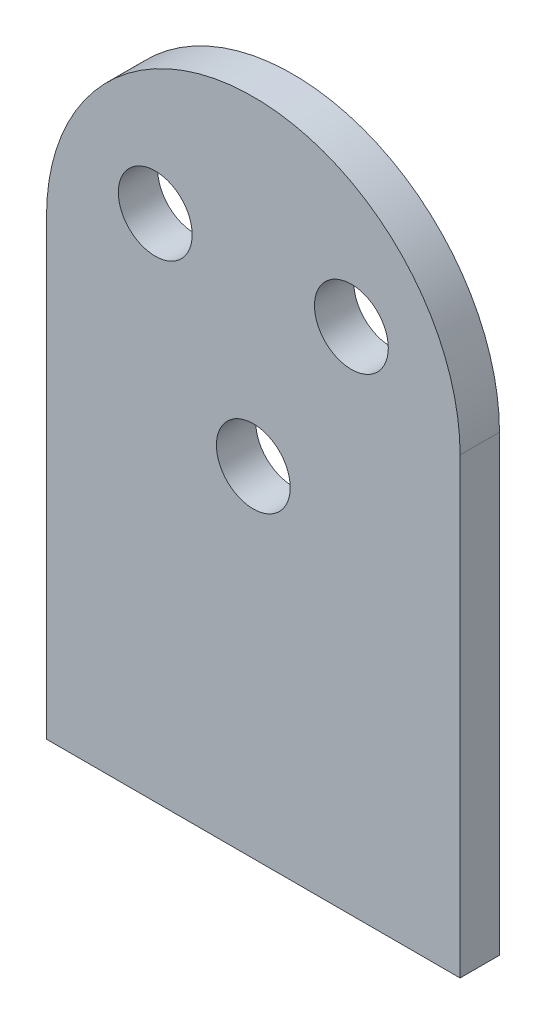
ISO-10303-21;
HEADER;
FILE_DESCRIPTION(('STEP AP214'),'2;1');
FILE_NAME('part.step','',(''),(''),'','','');
FILE_SCHEMA(('AUTOMOTIVE_DESIGN { 1 0 10303 214 1 1 1 1 }'));
ENDSEC;
DATA;
#1=APPLICATION_CONTEXT('core data for automotive mechanical design processes');
#2=APPLICATION_PROTOCOL_DEFINITION('international standard','automotive_design',2000,#1);
#3=PRODUCT_CONTEXT('',#1,'mechanical');
#4=PRODUCT('Part','Part','',(#3));
#5=PRODUCT_RELATED_PRODUCT_CATEGORY('part','',(#4));
#6=PRODUCT_DEFINITION_FORMATION('','',#4);
#7=PRODUCT_DEFINITION_CONTEXT('part definition',#1,'design');
#8=PRODUCT_DEFINITION('design','',#6,#7);
#9=PRODUCT_DEFINITION_SHAPE('','',#8);
#10=(LENGTH_UNIT() NAMED_UNIT(*) SI_UNIT(.MILLI.,.METRE.));
#11=(NAMED_UNIT(*) PLANE_ANGLE_UNIT() SI_UNIT($,.RADIAN.));
#12=(NAMED_UNIT(*) SI_UNIT($,.STERADIAN.) SOLID_ANGLE_UNIT());
#13=UNCERTAINTY_MEASURE_WITH_UNIT(LENGTH_MEASURE(1.E-05),#10,'distance_accuracy_value','');
#14=(GEOMETRIC_REPRESENTATION_CONTEXT(3) GLOBAL_UNCERTAINTY_ASSIGNED_CONTEXT((#13)) GLOBAL_UNIT_ASSIGNED_CONTEXT((#10,
#11,#12)) REPRESENTATION_CONTEXT('',''));
#15=CARTESIAN_POINT('',(0.,0.,0.));
#16=DIRECTION('',(0.,0.,1.));
#17=DIRECTION('',(1.,0.,0.));
#18=AXIS2_PLACEMENT_3D('',#15,#16,#17);
#19=CARTESIAN_POINT('',(0.,0.,0.8));
#20=DIRECTION('',(0.,0.,1.));
#21=DIRECTION('',(1.,0.,0.));
#22=AXIS2_PLACEMENT_3D('',#19,#20,#21);
#23=PLANE('',#22);
#24=CARTESIAN_POINT('',(1.99185842870421,1.15,0.8));
#25=DIRECTION('',(0.,0.,1.));
#26=DIRECTION('',(1.,0.,0.));
#27=AXIS2_PLACEMENT_3D('',#24,#25,#26);
#28=CIRCLE('',#27,0.75);
#29=CARTESIAN_POINT('',(2.74185842870421,1.15,0.8));
#30=VERTEX_POINT('',#29);
#31=EDGE_CURVE('E139',#30,#30,#28,.T.);
#32=ORIENTED_EDGE('',*,*,#31,.F.);
#33=EDGE_LOOP('',(#32));
#34=FACE_BOUND('',#33,.T.);
#35=CARTESIAN_POINT('',(0.,0.,0.8));
#36=DIRECTION('',(0.,0.,1.));
#37=DIRECTION('',(1.,0.,0.));
#38=AXIS2_PLACEMENT_3D('',#35,#36,#37);
#39=CIRCLE('',#38,4.2);
#40=CARTESIAN_POINT('',(4.2,0.,0.8));
#41=VERTEX_POINT('',#40);
#42=CARTESIAN_POINT('',(-4.2,0.,0.8));
#43=VERTEX_POINT('',#42);
#44=EDGE_CURVE('E94',#41,#43,#39,.T.);
#45=ORIENTED_EDGE('',*,*,#44,.T.);
#46=DIRECTION('',(0.,-1.,0.));
#47=VECTOR('',#46,1.);
#48=CARTESIAN_POINT('',(-4.2,0.,0.8));
#49=LINE('',#48,#47);
#50=CARTESIAN_POINT('',(-4.2,-9.2,0.8));
#51=VERTEX_POINT('',#50);
#52=EDGE_CURVE('E89',#43,#51,#49,.T.);
#53=ORIENTED_EDGE('',*,*,#52,.T.);
#54=DIRECTION('',(1.,0.,0.));
#55=VECTOR('',#54,1.);
#56=CARTESIAN_POINT('',(-4.2,-9.2,0.8));
#57=LINE('',#56,#55);
#58=CARTESIAN_POINT('',(4.2,-9.2,0.8));
#59=VERTEX_POINT('',#58);
#60=EDGE_CURVE('E92',#51,#59,#57,.T.);
#61=ORIENTED_EDGE('',*,*,#60,.T.);
#62=DIRECTION('',(0.,1.,0.));
#63=VECTOR('',#62,1.);
#64=CARTESIAN_POINT('',(4.2,-9.2,0.8));
#65=LINE('',#64,#63);
#66=EDGE_CURVE('E59',#59,#41,#65,.T.);
#67=ORIENTED_EDGE('',*,*,#66,.T.);
#68=EDGE_LOOP('',(#45,#53,#61,#67));
#69=FACE_BOUND('',#68,.T.);
#70=CARTESIAN_POINT('',(0.,-2.3,0.8));
#71=DIRECTION('',(0.,0.,1.));
#72=DIRECTION('',(1.,0.,0.));
#73=AXIS2_PLACEMENT_3D('',#70,#71,#72);
#74=CIRCLE('',#73,0.75);
#75=CARTESIAN_POINT('',(0.75,-2.3,0.8));
#76=VERTEX_POINT('',#75);
#77=EDGE_CURVE('E115',#76,#76,#74,.T.);
#78=ORIENTED_EDGE('',*,*,#77,.F.);
#79=EDGE_LOOP('',(#78));
#80=FACE_BOUND('',#79,.T.);
#81=CARTESIAN_POINT('',(-1.99185842870421,1.15,0.8));
#82=DIRECTION('',(0.,0.,1.));
#83=DIRECTION('',(1.,0.,0.));
#84=AXIS2_PLACEMENT_3D('',#81,#82,#83);
#85=CIRCLE('',#84,0.75);
#86=CARTESIAN_POINT('',(-1.24185842870421,1.15,0.8));
#87=VERTEX_POINT('',#86);
#88=EDGE_CURVE('E147',#87,#87,#85,.T.);
#89=ORIENTED_EDGE('',*,*,#88,.F.);
#90=EDGE_LOOP('',(#89));
#91=FACE_BOUND('',#90,.T.);
#92=ADVANCED_FACE('F41',(#34,#69,#80,#91),#23,.T.);
#93=CARTESIAN_POINT('',(0.,0.,0.));
#94=DIRECTION('',(0.,0.,1.));
#95=DIRECTION('',(1.,0.,0.));
#96=AXIS2_PLACEMENT_3D('',#93,#94,#95);
#97=PLANE('',#96);
#98=CARTESIAN_POINT('',(0.,0.,0.));
#99=DIRECTION('',(0.,0.,1.));
#100=DIRECTION('',(1.,0.,0.));
#101=AXIS2_PLACEMENT_3D('',#98,#99,#100);
#102=CIRCLE('',#101,4.2);
#103=CARTESIAN_POINT('',(4.2,0.,0.));
#104=VERTEX_POINT('',#103);
#105=CARTESIAN_POINT('',(-4.2,0.,0.));
#106=VERTEX_POINT('',#105);
#107=EDGE_CURVE('E111',#104,#106,#102,.T.);
#108=ORIENTED_EDGE('',*,*,#107,.F.);
#109=DIRECTION('',(0.,1.,0.));
#110=VECTOR('',#109,1.);
#111=CARTESIAN_POINT('',(4.2,-9.2,0.));
#112=LINE('',#111,#110);
#113=CARTESIAN_POINT('',(4.2,-9.2,0.));
#114=VERTEX_POINT('',#113);
#115=EDGE_CURVE('E82',#114,#104,#112,.T.);
#116=ORIENTED_EDGE('',*,*,#115,.F.);
#117=DIRECTION('',(1.,0.,0.));
#118=VECTOR('',#117,1.);
#119=CARTESIAN_POINT('',(-4.2,-9.2,0.));
#120=LINE('',#119,#118);
#121=CARTESIAN_POINT('',(-4.2,-9.2,0.));
#122=VERTEX_POINT('',#121);
#123=EDGE_CURVE('E76',#122,#114,#120,.T.);
#124=ORIENTED_EDGE('',*,*,#123,.F.);
#125=DIRECTION('',(0.,-1.,0.));
#126=VECTOR('',#125,1.);
#127=CARTESIAN_POINT('',(-4.2,0.,0.));
#128=LINE('',#127,#126);
#129=EDGE_CURVE('E99',#106,#122,#128,.T.);
#130=ORIENTED_EDGE('',*,*,#129,.F.);
#131=EDGE_LOOP('',(#108,#116,#124,#130));
#132=FACE_BOUND('',#131,.T.);
#133=CARTESIAN_POINT('',(0.,-2.3,0.));
#134=DIRECTION('',(0.,0.,1.));
#135=DIRECTION('',(1.,0.,0.));
#136=AXIS2_PLACEMENT_3D('',#133,#134,#135);
#137=CIRCLE('',#136,0.75);
#138=CARTESIAN_POINT('',(0.75,-2.3,0.));
#139=VERTEX_POINT('',#138);
#140=EDGE_CURVE('E135',#139,#139,#137,.T.);
#141=ORIENTED_EDGE('',*,*,#140,.T.);
#142=EDGE_LOOP('',(#141));
#143=FACE_BOUND('',#142,.T.);
#144=CARTESIAN_POINT('',(1.99185842870421,1.15,0.));
#145=DIRECTION('',(0.,0.,1.));
#146=DIRECTION('',(1.,0.,0.));
#147=AXIS2_PLACEMENT_3D('',#144,#145,#146);
#148=CIRCLE('',#147,0.75);
#149=CARTESIAN_POINT('',(2.74185842870421,1.15,0.));
#150=VERTEX_POINT('',#149);
#151=EDGE_CURVE('E143',#150,#150,#148,.T.);
#152=ORIENTED_EDGE('',*,*,#151,.T.);
#153=EDGE_LOOP('',(#152));
#154=FACE_BOUND('',#153,.T.);
#155=CARTESIAN_POINT('',(-1.99185842870421,1.15,0.));
#156=DIRECTION('',(0.,0.,1.));
#157=DIRECTION('',(1.,0.,0.));
#158=AXIS2_PLACEMENT_3D('',#155,#156,#157);
#159=CIRCLE('',#158,0.75);
#160=CARTESIAN_POINT('',(-1.24185842870421,1.15,0.));
#161=VERTEX_POINT('',#160);
#162=EDGE_CURVE('E151',#161,#161,#159,.T.);
#163=ORIENTED_EDGE('',*,*,#162,.T.);
#164=EDGE_LOOP('',(#163));
#165=FACE_BOUND('',#164,.T.);
#166=ADVANCED_FACE('F129',(#132,#143,#154,#165),#97,.F.);
#167=CARTESIAN_POINT('',(0.,0.,0.8));
#168=DIRECTION('',(0.,0.,-1.));
#169=DIRECTION('',(-1.,0.,0.));
#170=AXIS2_PLACEMENT_3D('',#167,#168,#169);
#171=CYLINDRICAL_SURFACE('',#170,4.2);
#172=ORIENTED_EDGE('',*,*,#107,.T.);
#173=DIRECTION('',(0.,0.,-1.));
#174=VECTOR('',#173,1.);
#175=CARTESIAN_POINT('',(-4.2,0.,0.8));
#176=LINE('',#175,#174);
#177=EDGE_CURVE('E11',#43,#106,#176,.T.);
#178=ORIENTED_EDGE('',*,*,#177,.F.);
#179=ORIENTED_EDGE('',*,*,#44,.F.);
#180=DIRECTION('',(0.,0.,-1.));
#181=VECTOR('',#180,1.);
#182=CARTESIAN_POINT('',(4.2,0.,0.8));
#183=LINE('',#182,#181);
#184=EDGE_CURVE('E107',#41,#104,#183,.T.);
#185=ORIENTED_EDGE('',*,*,#184,.T.);
#186=EDGE_LOOP('',(#172,#178,#179,#185));
#187=FACE_BOUND('',#186,.T.);
#188=ADVANCED_FACE('F43',(#187),#171,.T.);
#189=CARTESIAN_POINT('',(-4.2,0.,0.8));
#190=DIRECTION('',(1.,0.,0.));
#191=DIRECTION('',(0.,0.,-1.));
#192=AXIS2_PLACEMENT_3D('',#189,#190,#191);
#193=PLANE('',#192);
#194=ORIENTED_EDGE('',*,*,#129,.T.);
#195=DIRECTION('',(0.,0.,-1.));
#196=VECTOR('',#195,1.);
#197=CARTESIAN_POINT('',(-4.2,-9.2,0.8));
#198=LINE('',#197,#196);
#199=EDGE_CURVE('E51',#51,#122,#198,.T.);
#200=ORIENTED_EDGE('',*,*,#199,.F.);
#201=ORIENTED_EDGE('',*,*,#52,.F.);
#202=ORIENTED_EDGE('',*,*,#177,.T.);
#203=EDGE_LOOP('',(#194,#200,#201,#202));
#204=FACE_BOUND('',#203,.T.);
#205=ADVANCED_FACE('F98',(#204),#193,.F.);
#206=CARTESIAN_POINT('',(-4.2,-9.2,0.8));
#207=DIRECTION('',(0.,1.,0.));
#208=DIRECTION('',(0.,0.,1.));
#209=AXIS2_PLACEMENT_3D('',#206,#207,#208);
#210=PLANE('',#209);
#211=ORIENTED_EDGE('',*,*,#123,.T.);
#212=DIRECTION('',(0.,0.,-1.));
#213=VECTOR('',#212,1.);
#214=CARTESIAN_POINT('',(4.2,-9.2,0.8));
#215=LINE('',#214,#213);
#216=EDGE_CURVE('E101',#59,#114,#215,.T.);
#217=ORIENTED_EDGE('',*,*,#216,.F.);
#218=ORIENTED_EDGE('',*,*,#60,.F.);
#219=ORIENTED_EDGE('',*,*,#199,.T.);
#220=EDGE_LOOP('',(#211,#217,#218,#219));
#221=FACE_BOUND('',#220,.T.);
#222=ADVANCED_FACE('F102',(#221),#210,.F.);
#223=CARTESIAN_POINT('',(4.2,-9.2,0.8));
#224=DIRECTION('',(-1.,0.,0.));
#225=DIRECTION('',(0.,0.,1.));
#226=AXIS2_PLACEMENT_3D('',#223,#224,#225);
#227=PLANE('',#226);
#228=ORIENTED_EDGE('',*,*,#115,.T.);
#229=ORIENTED_EDGE('',*,*,#184,.F.);
#230=ORIENTED_EDGE('',*,*,#66,.F.);
#231=ORIENTED_EDGE('',*,*,#216,.T.);
#232=EDGE_LOOP('',(#228,#229,#230,#231));
#233=FACE_BOUND('',#232,.T.);
#234=ADVANCED_FACE('F126',(#233),#227,.F.);
#235=CARTESIAN_POINT('',(0.,-2.3,0.8));
#236=DIRECTION('',(0.,0.,-1.));
#237=DIRECTION('',(-1.,0.,0.));
#238=AXIS2_PLACEMENT_3D('',#235,#236,#237);
#239=CYLINDRICAL_SURFACE('',#238,0.75);
#240=ORIENTED_EDGE('',*,*,#77,.T.);
#241=EDGE_LOOP('',(#240));
#242=FACE_BOUND('',#241,.T.);
#243=ORIENTED_EDGE('',*,*,#140,.F.);
#244=EDGE_LOOP('',(#243));
#245=FACE_BOUND('',#244,.T.);
#246=ADVANCED_FACE('F172',(#242,#245),#239,.F.);
#247=CARTESIAN_POINT('',(1.99185842870421,1.15,0.8));
#248=DIRECTION('',(0.,0.,-1.));
#249=DIRECTION('',(-1.,0.,0.));
#250=AXIS2_PLACEMENT_3D('',#247,#248,#249);
#251=CYLINDRICAL_SURFACE('',#250,0.75);
#252=ORIENTED_EDGE('',*,*,#31,.T.);
#253=EDGE_LOOP('',(#252));
#254=FACE_BOUND('',#253,.T.);
#255=ORIENTED_EDGE('',*,*,#151,.F.);
#256=EDGE_LOOP('',(#255));
#257=FACE_BOUND('',#256,.T.);
#258=ADVANCED_FACE('F227',(#254,#257),#251,.F.);
#259=CARTESIAN_POINT('',(-1.99185842870421,1.15,0.8));
#260=DIRECTION('',(0.,0.,-1.));
#261=DIRECTION('',(-1.,0.,0.));
#262=AXIS2_PLACEMENT_3D('',#259,#260,#261);
#263=CYLINDRICAL_SURFACE('',#262,0.75);
#264=ORIENTED_EDGE('',*,*,#88,.T.);
#265=EDGE_LOOP('',(#264));
#266=FACE_BOUND('',#265,.T.);
#267=ORIENTED_EDGE('',*,*,#162,.F.);
#268=EDGE_LOOP('',(#267));
#269=FACE_BOUND('',#268,.T.);
#270=ADVANCED_FACE('F160',(#266,#269),#263,.F.);
#271=CLOSED_SHELL('',(#92,#166,#188,#205,#222,#234,#246,#258,#270));
#272=MANIFOLD_SOLID_BREP('B2',#271);
#273=ADVANCED_BREP_SHAPE_REPRESENTATION('',(#18,#272),#14);
#274=SHAPE_DEFINITION_REPRESENTATION(#9,#273);
ENDSEC;
END-ISO-10303-21;
